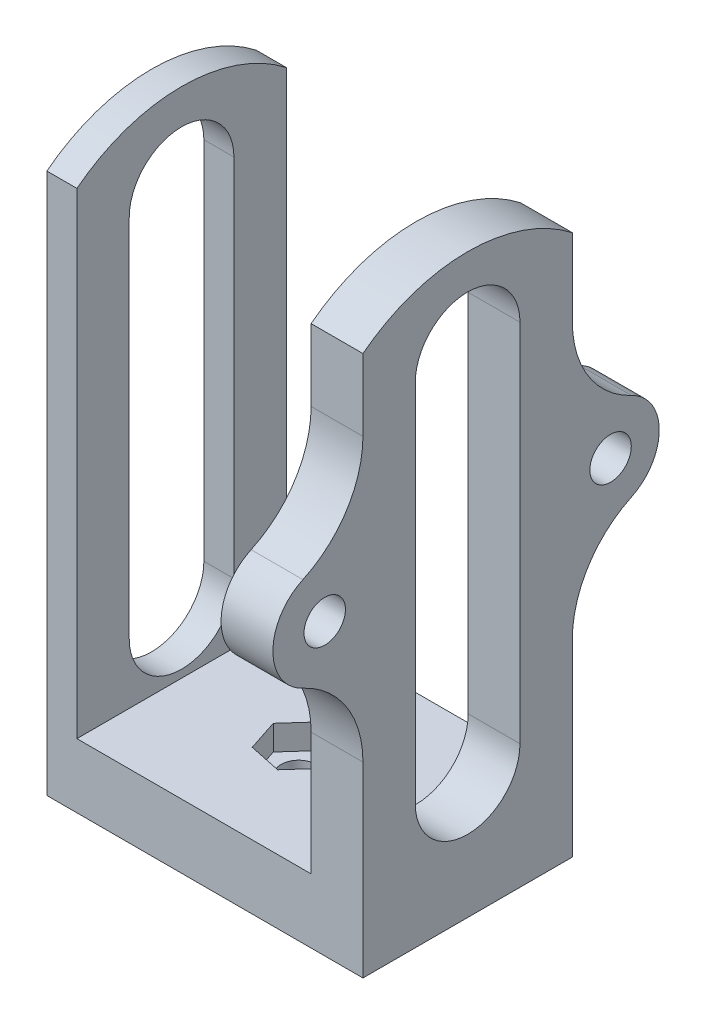
ISO-10303-21;
HEADER;
FILE_DESCRIPTION(('STEP AP214'),'2;1');
FILE_NAME('part.step','',(''),(''),'','','');
FILE_SCHEMA(('AUTOMOTIVE_DESIGN { 1 0 10303 214 1 1 1 1 }'));
ENDSEC;
DATA;
#1=APPLICATION_CONTEXT('core data for automotive mechanical design processes');
#2=APPLICATION_PROTOCOL_DEFINITION('international standard','automotive_design',2000,#1);
#3=PRODUCT_CONTEXT('',#1,'mechanical');
#4=PRODUCT('Part','Part','',(#3));
#5=PRODUCT_RELATED_PRODUCT_CATEGORY('part','',(#4));
#6=PRODUCT_DEFINITION_FORMATION('','',#4);
#7=PRODUCT_DEFINITION_CONTEXT('part definition',#1,'design');
#8=PRODUCT_DEFINITION('design','',#6,#7);
#9=PRODUCT_DEFINITION_SHAPE('','',#8);
#10=(LENGTH_UNIT() NAMED_UNIT(*) SI_UNIT(.MILLI.,.METRE.));
#11=(NAMED_UNIT(*) PLANE_ANGLE_UNIT() SI_UNIT($,.RADIAN.));
#12=(NAMED_UNIT(*) SI_UNIT($,.STERADIAN.) SOLID_ANGLE_UNIT());
#13=UNCERTAINTY_MEASURE_WITH_UNIT(LENGTH_MEASURE(1.E-05),#10,'distance_accuracy_value','');
#14=(GEOMETRIC_REPRESENTATION_CONTEXT(3) GLOBAL_UNCERTAINTY_ASSIGNED_CONTEXT((#13)) GLOBAL_UNIT_ASSIGNED_CONTEXT((#10,
#11,#12)) REPRESENTATION_CONTEXT('',''));
#15=CARTESIAN_POINT('',(0.,0.,0.));
#16=DIRECTION('',(0.,0.,1.));
#17=DIRECTION('',(1.,0.,0.));
#18=AXIS2_PLACEMENT_3D('',#15,#16,#17);
#19=CARTESIAN_POINT('',(11.7,-16.2,-10.1));
#20=DIRECTION('',(0.,1.,0.));
#21=DIRECTION('',(-1.,0.,0.));
#22=AXIS2_PLACEMENT_3D('',#19,#20,#21);
#23=CYLINDRICAL_SURFACE('',#22,1.7);
#24=CARTESIAN_POINT('',(11.7,-1.14491749414469E-13,-10.1));
#25=DIRECTION('',(0.,-1.,0.));
#26=DIRECTION('',(1.,0.,0.));
#27=AXIS2_PLACEMENT_3D('',#24,#25,#26);
#28=CIRCLE('',#27,1.7);
#29=CARTESIAN_POINT('',(13.4,-1.15124282314152E-13,-10.1));
#30=VERTEX_POINT('',#29);
#31=EDGE_CURVE('E290',#30,#30,#28,.T.);
#32=ORIENTED_EDGE('',*,*,#31,.T.);
#33=EDGE_LOOP('',(#32));
#34=FACE_BOUND('',#33,.T.);
#35=CARTESIAN_POINT('',(11.7,3.80000000000002,-10.1));
#36=DIRECTION('',(0.,1.,0.));
#37=DIRECTION('',(-1.,0.,0.));
#38=AXIS2_PLACEMENT_3D('',#35,#36,#37);
#39=CIRCLE('',#38,1.7);
#40=CARTESIAN_POINT('',(9.99999999999999,3.80000000000002,-10.1));
#41=VERTEX_POINT('',#40);
#42=EDGE_CURVE('E41',#41,#41,#39,.F.);
#43=ORIENTED_EDGE('',*,*,#42,.F.);
#44=EDGE_LOOP('',(#43));
#45=FACE_BOUND('',#44,.T.);
#46=ADVANCED_FACE('F37',(#34,#45),#23,.F.);
#47=CARTESIAN_POINT('',(0.,12.,-10.1));
#48=DIRECTION('',(1.,0.,0.));
#49=DIRECTION('',(0.,0.,-1.));
#50=AXIS2_PLACEMENT_3D('',#47,#48,#49);
#51=CYLINDRICAL_SURFACE('',#50,5.05);
#52=CARTESIAN_POINT('',(0.399999999999996,12.,-10.1));
#53=DIRECTION('',(1.,0.,0.));
#54=DIRECTION('',(0.,0.,-1.));
#55=AXIS2_PLACEMENT_3D('',#52,#53,#54);
#56=CIRCLE('',#55,5.05);
#57=CARTESIAN_POINT('',(0.399999999999994,12.,-15.15));
#58=VERTEX_POINT('',#57);
#59=CARTESIAN_POINT('',(0.399999999999996,12.,-5.05));
#60=VERTEX_POINT('',#59);
#61=EDGE_CURVE('E62',#58,#60,#56,.F.);
#62=ORIENTED_EDGE('',*,*,#61,.F.);
#63=DIRECTION('',(1.,0.,0.));
#64=VECTOR('',#63,1.);
#65=CARTESIAN_POINT('',(0.,12.,-15.15));
#66=LINE('',#65,#64);
#67=CARTESIAN_POINT('',(-2.50000000000001,12.,-15.15));
#68=VERTEX_POINT('',#67);
#69=EDGE_CURVE('E480',#68,#58,#66,.T.);
#70=ORIENTED_EDGE('',*,*,#69,.F.);
#71=CARTESIAN_POINT('',(-2.5,12.,-10.1));
#72=DIRECTION('',(-1.,0.,0.));
#73=DIRECTION('',(0.,0.,1.));
#74=AXIS2_PLACEMENT_3D('',#71,#72,#73);
#75=CIRCLE('',#74,5.05);
#76=CARTESIAN_POINT('',(-2.5,12.,-5.05));
#77=VERTEX_POINT('',#76);
#78=EDGE_CURVE('E316',#68,#77,#75,.T.);
#79=ORIENTED_EDGE('',*,*,#78,.T.);
#80=DIRECTION('',(1.,0.,0.));
#81=VECTOR('',#80,1.);
#82=CARTESIAN_POINT('',(0.,12.,-5.05));
#83=LINE('',#82,#81);
#84=EDGE_CURVE('E483',#77,#60,#83,.T.);
#85=ORIENTED_EDGE('',*,*,#84,.T.);
#86=EDGE_LOOP('',(#62,#70,#79,#85));
#87=FACE_BOUND('',#86,.T.);
#88=ADVANCED_FACE('F546',(#87),#51,.F.);
#89=CARTESIAN_POINT('',(0.,47.2223420938085,-15.15));
#90=DIRECTION('',(0.,0.,-1.));
#91=DIRECTION('',(0.,1.,0.));
#92=AXIS2_PLACEMENT_3D('',#89,#90,#91);
#93=PLANE('',#92);
#94=DIRECTION('',(0.,-1.,0.));
#95=VECTOR('',#94,1.);
#96=CARTESIAN_POINT('',(0.39999999999999,47.2223420938085,-15.15));
#97=LINE('',#96,#95);
#98=CARTESIAN_POINT('',(0.39999999999999,47.2223420938085,-15.15));
#99=VERTEX_POINT('',#98);
#100=EDGE_CURVE('E307',#99,#58,#97,.T.);
#101=ORIENTED_EDGE('',*,*,#100,.F.);
#102=DIRECTION('',(1.,0.,0.));
#103=VECTOR('',#102,1.);
#104=CARTESIAN_POINT('',(0.,47.2223420938085,-15.15));
#105=LINE('',#104,#103);
#106=CARTESIAN_POINT('',(-2.50000000000001,47.2223420938085,-15.15));
#107=VERTEX_POINT('',#106);
#108=EDGE_CURVE('E476',#107,#99,#105,.T.);
#109=ORIENTED_EDGE('',*,*,#108,.F.);
#110=DIRECTION('',(0.,-1.,0.));
#111=VECTOR('',#110,1.);
#112=CARTESIAN_POINT('',(-2.50000000000001,47.2223420938085,-15.15));
#113=LINE('',#112,#111);
#114=EDGE_CURVE('E313',#107,#68,#113,.T.);
#115=ORIENTED_EDGE('',*,*,#114,.T.);
#116=ORIENTED_EDGE('',*,*,#69,.T.);
#117=EDGE_LOOP('',(#101,#109,#115,#116));
#118=FACE_BOUND('',#117,.T.);
#119=ADVANCED_FACE('F553',(#118),#93,.F.);
#120=CARTESIAN_POINT('',(0.,47.2223420938085,-10.1));
#121=DIRECTION('',(1.,0.,0.));
#122=DIRECTION('',(0.,0.,-1.));
#123=AXIS2_PLACEMENT_3D('',#120,#121,#122);
#124=CYLINDRICAL_SURFACE('',#123,5.04999999999999);
#125=CARTESIAN_POINT('',(0.399999999999992,47.2223420938085,-10.1));
#126=DIRECTION('',(1.,0.,0.));
#127=DIRECTION('',(0.,0.,-1.));
#128=AXIS2_PLACEMENT_3D('',#125,#126,#127);
#129=CIRCLE('',#128,5.04999999999999);
#130=CARTESIAN_POINT('',(0.399999999999994,47.2223420938085,-5.05000000000004));
#131=VERTEX_POINT('',#130);
#132=EDGE_CURVE('E305',#131,#99,#129,.F.);
#133=ORIENTED_EDGE('',*,*,#132,.F.);
#134=DIRECTION('',(1.,0.,0.));
#135=VECTOR('',#134,1.);
#136=CARTESIAN_POINT('',(0.,47.2223420938085,-5.05000000000004));
#137=LINE('',#136,#135);
#138=CARTESIAN_POINT('',(-2.50000000000001,47.2223420938085,-5.05000000000004));
#139=VERTEX_POINT('',#138);
#140=EDGE_CURVE('E388',#139,#131,#137,.T.);
#141=ORIENTED_EDGE('',*,*,#140,.F.);
#142=CARTESIAN_POINT('',(-2.50000000000001,47.2223420938085,-10.1));
#143=DIRECTION('',(-1.,0.,0.));
#144=DIRECTION('',(0.,0.,1.));
#145=AXIS2_PLACEMENT_3D('',#142,#143,#144);
#146=CIRCLE('',#145,5.04999999999999);
#147=EDGE_CURVE('E310',#139,#107,#146,.T.);
#148=ORIENTED_EDGE('',*,*,#147,.T.);
#149=ORIENTED_EDGE('',*,*,#108,.T.);
#150=EDGE_LOOP('',(#133,#141,#148,#149));
#151=FACE_BOUND('',#150,.T.);
#152=ADVANCED_FACE('F778',(#151),#124,.F.);
#153=CARTESIAN_POINT('',(0.,12.,-5.05));
#154=DIRECTION('',(0.,0.,1.));
#155=DIRECTION('',(0.,-1.,0.));
#156=AXIS2_PLACEMENT_3D('',#153,#154,#155);
#157=PLANE('',#156);
#158=DIRECTION('',(0.,1.,0.));
#159=VECTOR('',#158,1.);
#160=CARTESIAN_POINT('',(0.399999999999998,12.,-5.05));
#161=LINE('',#160,#159);
#162=EDGE_CURVE('E303',#60,#131,#161,.T.);
#163=ORIENTED_EDGE('',*,*,#162,.F.);
#164=ORIENTED_EDGE('',*,*,#84,.F.);
#165=DIRECTION('',(0.,1.,0.));
#166=VECTOR('',#165,1.);
#167=CARTESIAN_POINT('',(-2.50000000000001,47.2223420938085,-5.05000000000004));
#168=LINE('',#167,#166);
#169=EDGE_CURVE('E319',#77,#139,#168,.T.);
#170=ORIENTED_EDGE('',*,*,#169,.T.);
#171=ORIENTED_EDGE('',*,*,#140,.T.);
#172=EDGE_LOOP('',(#163,#164,#170,#171));
#173=FACE_BOUND('',#172,.T.);
#174=ADVANCED_FACE('F789',(#173),#157,.F.);
#175=CARTESIAN_POINT('',(0.,39.1850926484793,-10.1));
#176=DIRECTION('',(1.,0.,0.));
#177=DIRECTION('',(0.,0.,-1.));
#178=AXIS2_PLACEMENT_3D('',#175,#176,#177);
#179=CYLINDRICAL_SURFACE('',#178,16.4580679801224);
#180=DIRECTION('',(1.,0.,0.));
#181=VECTOR('',#180,1.);
#182=CARTESIAN_POINT('',(0.,52.1796300253284,0.));
#183=LINE('',#182,#181);
#184=CARTESIAN_POINT('',(-2.50000000000001,52.1796300253284,0.));
#185=VERTEX_POINT('',#184);
#186=CARTESIAN_POINT('',(0.399999999999995,52.1796300253284,0.));
#187=VERTEX_POINT('',#186);
#188=EDGE_CURVE('E473',#185,#187,#183,.T.);
#189=ORIENTED_EDGE('',*,*,#188,.T.);
#190=CARTESIAN_POINT('',(0.399999999999993,39.1850926484793,-10.1));
#191=DIRECTION('',(1.,0.,0.));
#192=DIRECTION('',(0.,0.,-1.));
#193=AXIS2_PLACEMENT_3D('',#190,#191,#192);
#194=CIRCLE('',#193,16.4580679801224);
#195=CARTESIAN_POINT('',(0.399999999999988,52.1796300253284,-20.2));
#196=VERTEX_POINT('',#195);
#197=EDGE_CURVE('E301',#196,#187,#194,.T.);
#198=ORIENTED_EDGE('',*,*,#197,.F.);
#199=DIRECTION('',(1.,0.,0.));
#200=VECTOR('',#199,1.);
#201=CARTESIAN_POINT('',(0.,52.1796300253284,-20.2));
#202=LINE('',#201,#200);
#203=CARTESIAN_POINT('',(-2.50000000000001,52.1796300253284,-20.2));
#204=VERTEX_POINT('',#203);
#205=EDGE_CURVE('E479',#204,#196,#202,.T.);
#206=ORIENTED_EDGE('',*,*,#205,.F.);
#207=CARTESIAN_POINT('',(-2.50000000000001,39.1850926484793,-10.1));
#208=DIRECTION('',(-1.,0.,0.));
#209=DIRECTION('',(0.,0.,1.));
#210=AXIS2_PLACEMENT_3D('',#207,#208,#209);
#211=CIRCLE('',#210,16.4580679801224);
#212=EDGE_CURVE('E331',#185,#204,#211,.T.);
#213=ORIENTED_EDGE('',*,*,#212,.F.);
#214=EDGE_LOOP('',(#189,#198,#206,#213));
#215=FACE_BOUND('',#214,.T.);
#216=ADVANCED_FACE('F39',(#215),#179,.T.);
#217=CARTESIAN_POINT('',(23.,18.041981199993,0.));
#218=DIRECTION('',(0.,0.,1.));
#219=DIRECTION('',(0.,-1.,0.));
#220=AXIS2_PLACEMENT_3D('',#217,#218,#219);
#221=PLANE('',#220);
#222=DIRECTION('',(1.,0.,0.));
#223=VECTOR('',#222,1.);
#224=CARTESIAN_POINT('',(2.8,6.2,0.));
#225=LINE('',#224,#223);
#226=CARTESIAN_POINT('',(0.4,6.2,0.));
#227=VERTEX_POINT('',#226);
#228=CARTESIAN_POINT('',(23.,6.2,0.));
#229=VERTEX_POINT('',#228);
#230=EDGE_CURVE('E393',#227,#229,#225,.T.);
#231=ORIENTED_EDGE('',*,*,#230,.F.);
#232=DIRECTION('',(0.,-1.,0.));
#233=VECTOR('',#232,1.);
#234=CARTESIAN_POINT('',(0.399999999999995,52.1796300253284,0.));
#235=LINE('',#234,#233);
#236=EDGE_CURVE('E293',#187,#227,#235,.T.);
#237=ORIENTED_EDGE('',*,*,#236,.F.);
#238=ORIENTED_EDGE('',*,*,#188,.F.);
#239=DIRECTION('',(0.,1.,0.));
#240=VECTOR('',#239,1.);
#241=CARTESIAN_POINT('',(-2.5,0.,0.));
#242=LINE('',#241,#240);
#243=CARTESIAN_POINT('',(-2.5,0.,0.));
#244=VERTEX_POINT('',#243);
#245=EDGE_CURVE('E328',#244,#185,#242,.T.);
#246=ORIENTED_EDGE('',*,*,#245,.F.);
#247=DIRECTION('',(1.,0.,0.));
#248=VECTOR('',#247,1.);
#249=CARTESIAN_POINT('',(23.,-1.16110653565093E-13,0.));
#250=LINE('',#249,#248);
#251=CARTESIAN_POINT('',(28.,-1.17971044446513E-13,0.));
#252=VERTEX_POINT('',#251);
#253=EDGE_CURVE('E448',#244,#252,#250,.T.);
#254=ORIENTED_EDGE('',*,*,#253,.T.);
#255=DIRECTION('',(0.,-1.,0.));
#256=VECTOR('',#255,1.);
#257=CARTESIAN_POINT('',(28.,18.041981199993,0.));
#258=LINE('',#257,#256);
#259=CARTESIAN_POINT('',(28.,18.041981199993,0.));
#260=VERTEX_POINT('',#259);
#261=EDGE_CURVE('E355',#260,#252,#258,.T.);
#262=ORIENTED_EDGE('',*,*,#261,.F.);
#263=DIRECTION('',(1.,0.,0.));
#264=VECTOR('',#263,1.);
#265=CARTESIAN_POINT('',(23.,18.041981199993,0.));
#266=LINE('',#265,#264);
#267=CARTESIAN_POINT('',(23.,18.041981199993,0.));
#268=VERTEX_POINT('',#267);
#269=EDGE_CURVE('E46',#268,#260,#266,.T.);
#270=ORIENTED_EDGE('',*,*,#269,.F.);
#271=DIRECTION('',(0.,-1.,0.));
#272=VECTOR('',#271,1.);
#273=CARTESIAN_POINT('',(23.,18.041981199993,0.));
#274=LINE('',#273,#272);
#275=EDGE_CURVE('E411',#268,#229,#274,.T.);
#276=ORIENTED_EDGE('',*,*,#275,.T.);
#277=EDGE_LOOP('',(#231,#237,#238,#246,#254,#262,#270,#276));
#278=FACE_BOUND('',#277,.T.);
#279=ADVANCED_FACE('F504',(#278),#221,.T.);
#280=CARTESIAN_POINT('',(23.,18.041981199993,10.));
#281=DIRECTION('',(1.,0.,0.));
#282=DIRECTION('',(0.,0.,-1.));
#283=AXIS2_PLACEMENT_3D('',#280,#281,#282);
#284=CYLINDRICAL_SURFACE('',#283,10.);
#285=ORIENTED_EDGE('',*,*,#269,.T.);
#286=CARTESIAN_POINT('',(28.,18.041981199993,10.));
#287=DIRECTION('',(-1.,0.,0.));
#288=DIRECTION('',(0.,0.,-1.));
#289=AXIS2_PLACEMENT_3D('',#286,#287,#288);
#290=CIRCLE('',#289,10.);
#291=CARTESIAN_POINT('',(28.,27.1141339519894,5.79333333333336));
#292=VERTEX_POINT('',#291);
#293=EDGE_CURVE('E352',#292,#260,#290,.T.);
#294=ORIENTED_EDGE('',*,*,#293,.F.);
#295=DIRECTION('',(1.,0.,0.));
#296=VECTOR('',#295,1.);
#297=CARTESIAN_POINT('',(23.,27.1141339519894,5.79333333333335));
#298=LINE('',#297,#296);
#299=CARTESIAN_POINT('',(23.,27.1141339519894,5.79333333333335));
#300=VERTEX_POINT('',#299);
#301=EDGE_CURVE('E450',#300,#292,#298,.T.);
#302=ORIENTED_EDGE('',*,*,#301,.F.);
#303=CARTESIAN_POINT('',(23.,18.041981199993,10.));
#304=DIRECTION('',(-1.,0.,0.));
#305=DIRECTION('',(0.,0.,-1.));
#306=AXIS2_PLACEMENT_3D('',#303,#304,#305);
#307=CIRCLE('',#306,10.);
#308=EDGE_CURVE('E445',#300,#268,#307,.T.);
#309=ORIENTED_EDGE('',*,*,#308,.T.);
#310=EDGE_LOOP('',(#285,#294,#302,#309));
#311=FACE_BOUND('',#310,.T.);
#312=ADVANCED_FACE('F590',(#311),#284,.F.);
#313=CARTESIAN_POINT('',(23.,31.6502103279876,3.69000000000002));
#314=DIRECTION('',(1.,0.,0.));
#315=DIRECTION('',(0.,0.,-1.));
#316=AXIS2_PLACEMENT_3D('',#313,#314,#315);
#317=CYLINDRICAL_SURFACE('',#316,5.);
#318=ORIENTED_EDGE('',*,*,#301,.T.);
#319=CARTESIAN_POINT('',(28.,31.6502103279876,3.69000000000003));
#320=DIRECTION('',(1.,0.,0.));
#321=DIRECTION('',(0.,0.,-1.));
#322=AXIS2_PLACEMENT_3D('',#319,#320,#321);
#323=CIRCLE('',#322,5.);
#324=CARTESIAN_POINT('',(28.,36.1862867039858,5.79333333333335));
#325=VERTEX_POINT('',#324);
#326=EDGE_CURVE('E385',#325,#292,#323,.T.);
#327=ORIENTED_EDGE('',*,*,#326,.F.);
#328=DIRECTION('',(1.,0.,0.));
#329=VECTOR('',#328,1.);
#330=CARTESIAN_POINT('',(23.,36.1862867039858,5.79333333333335));
#331=LINE('',#330,#329);
#332=CARTESIAN_POINT('',(23.,36.1862867039858,5.79333333333335));
#333=VERTEX_POINT('',#332);
#334=EDGE_CURVE('E452',#333,#325,#331,.T.);
#335=ORIENTED_EDGE('',*,*,#334,.F.);
#336=CARTESIAN_POINT('',(23.,31.6502103279876,3.69000000000002));
#337=DIRECTION('',(1.,0.,0.));
#338=DIRECTION('',(0.,0.,-1.));
#339=AXIS2_PLACEMENT_3D('',#336,#337,#338);
#340=CIRCLE('',#339,5.);
#341=EDGE_CURVE('E442',#333,#300,#340,.T.);
#342=ORIENTED_EDGE('',*,*,#341,.T.);
#343=EDGE_LOOP('',(#318,#327,#335,#342));
#344=FACE_BOUND('',#343,.T.);
#345=ADVANCED_FACE('F593',(#344),#317,.T.);
#346=CARTESIAN_POINT('',(23.,45.2584394559822,10.));
#347=DIRECTION('',(1.,0.,0.));
#348=DIRECTION('',(0.,0.,-1.));
#349=AXIS2_PLACEMENT_3D('',#346,#347,#348);
#350=CYLINDRICAL_SURFACE('',#349,10.);
#351=ORIENTED_EDGE('',*,*,#334,.T.);
#352=CARTESIAN_POINT('',(28.,45.2584394559822,10.));
#353=DIRECTION('',(-1.,0.,0.));
#354=DIRECTION('',(0.,0.,-1.));
#355=AXIS2_PLACEMENT_3D('',#352,#353,#354);
#356=CIRCLE('',#355,10.);
#357=CARTESIAN_POINT('',(28.,45.2584394559822,0.));
#358=VERTEX_POINT('',#357);
#359=EDGE_CURVE('E382',#358,#325,#356,.T.);
#360=ORIENTED_EDGE('',*,*,#359,.F.);
#361=DIRECTION('',(1.,0.,0.));
#362=VECTOR('',#361,1.);
#363=CARTESIAN_POINT('',(23.,45.2584394559822,0.));
#364=LINE('',#363,#362);
#365=CARTESIAN_POINT('',(23.,45.2584394559822,0.));
#366=VERTEX_POINT('',#365);
#367=EDGE_CURVE('E454',#366,#358,#364,.T.);
#368=ORIENTED_EDGE('',*,*,#367,.F.);
#369=CARTESIAN_POINT('',(23.,45.2584394559822,10.));
#370=DIRECTION('',(-1.,0.,0.));
#371=DIRECTION('',(0.,0.,1.));
#372=AXIS2_PLACEMENT_3D('',#369,#370,#371);
#373=CIRCLE('',#372,10.);
#374=EDGE_CURVE('E439',#366,#333,#373,.T.);
#375=ORIENTED_EDGE('',*,*,#374,.T.);
#376=EDGE_LOOP('',(#351,#360,#368,#375));
#377=FACE_BOUND('',#376,.T.);
#378=ADVANCED_FACE('F597',(#377),#350,.F.);
#379=CARTESIAN_POINT('',(23.,52.1796300253283,0.));
#380=DIRECTION('',(0.,0.,1.));
#381=DIRECTION('',(0.,-1.,0.));
#382=AXIS2_PLACEMENT_3D('',#379,#380,#381);
#383=PLANE('',#382);
#384=ORIENTED_EDGE('',*,*,#367,.T.);
#385=DIRECTION('',(0.,-1.,0.));
#386=VECTOR('',#385,1.);
#387=CARTESIAN_POINT('',(28.,52.1796300253283,0.));
#388=LINE('',#387,#386);
#389=CARTESIAN_POINT('',(28.,52.1796300253283,0.));
#390=VERTEX_POINT('',#389);
#391=EDGE_CURVE('E379',#390,#358,#388,.T.);
#392=ORIENTED_EDGE('',*,*,#391,.F.);
#393=DIRECTION('',(1.,0.,0.));
#394=VECTOR('',#393,1.);
#395=CARTESIAN_POINT('',(23.,52.1796300253283,0.));
#396=LINE('',#395,#394);
#397=CARTESIAN_POINT('',(23.,52.1796300253283,0.));
#398=VERTEX_POINT('',#397);
#399=EDGE_CURVE('E456',#398,#390,#396,.T.);
#400=ORIENTED_EDGE('',*,*,#399,.F.);
#401=DIRECTION('',(0.,-1.,0.));
#402=VECTOR('',#401,1.);
#403=CARTESIAN_POINT('',(23.,52.1796300253283,0.));
#404=LINE('',#403,#402);
#405=EDGE_CURVE('E436',#398,#366,#404,.T.);
#406=ORIENTED_EDGE('',*,*,#405,.T.);
#407=EDGE_LOOP('',(#384,#392,#400,#406));
#408=FACE_BOUND('',#407,.T.);
#409=ADVANCED_FACE('F601',(#408),#383,.T.);
#410=CARTESIAN_POINT('',(23.,39.1850926484792,-10.1));
#411=DIRECTION('',(1.,0.,0.));
#412=DIRECTION('',(0.,0.,-1.));
#413=AXIS2_PLACEMENT_3D('',#410,#411,#412);
#414=CYLINDRICAL_SURFACE('',#413,16.4580679801224);
#415=ORIENTED_EDGE('',*,*,#399,.T.);
#416=CARTESIAN_POINT('',(28.,39.1850926484792,-10.1));
#417=DIRECTION('',(1.,0.,0.));
#418=DIRECTION('',(0.,0.,-1.));
#419=AXIS2_PLACEMENT_3D('',#416,#417,#418);
#420=CIRCLE('',#419,16.4580679801224);
#421=CARTESIAN_POINT('',(28.,52.1796300253283,-20.2));
#422=VERTEX_POINT('',#421);
#423=EDGE_CURVE('E376',#422,#390,#420,.T.);
#424=ORIENTED_EDGE('',*,*,#423,.F.);
#425=DIRECTION('',(1.,0.,0.));
#426=VECTOR('',#425,1.);
#427=CARTESIAN_POINT('',(23.,52.1796300253283,-20.2));
#428=LINE('',#427,#426);
#429=CARTESIAN_POINT('',(23.,52.1796300253283,-20.2));
#430=VERTEX_POINT('',#429);
#431=EDGE_CURVE('E458',#430,#422,#428,.T.);
#432=ORIENTED_EDGE('',*,*,#431,.F.);
#433=CARTESIAN_POINT('',(23.,39.1850926484792,-10.1));
#434=DIRECTION('',(1.,0.,0.));
#435=DIRECTION('',(0.,0.,-1.));
#436=AXIS2_PLACEMENT_3D('',#433,#434,#435);
#437=CIRCLE('',#436,16.4580679801224);
#438=EDGE_CURVE('E433',#430,#398,#437,.T.);
#439=ORIENTED_EDGE('',*,*,#438,.T.);
#440=EDGE_LOOP('',(#415,#424,#432,#439));
#441=FACE_BOUND('',#440,.T.);
#442=ADVANCED_FACE('F605',(#441),#414,.T.);
#443=CARTESIAN_POINT('',(23.,44.754426549422,-20.2));
#444=DIRECTION('',(0.,0.,-1.));
#445=DIRECTION('',(0.,1.,0.));
#446=AXIS2_PLACEMENT_3D('',#443,#444,#445);
#447=PLANE('',#446);
#448=ORIENTED_EDGE('',*,*,#431,.T.);
#449=DIRECTION('',(0.,1.,0.));
#450=VECTOR('',#449,1.);
#451=CARTESIAN_POINT('',(28.,44.754426549422,-20.2));
#452=LINE('',#451,#450);
#453=CARTESIAN_POINT('',(28.,44.754426549422,-20.2));
#454=VERTEX_POINT('',#453);
#455=EDGE_CURVE('E373',#454,#422,#452,.T.);
#456=ORIENTED_EDGE('',*,*,#455,.F.);
#457=DIRECTION('',(1.,0.,0.));
#458=VECTOR('',#457,1.);
#459=CARTESIAN_POINT('',(23.,44.754426549422,-20.2));
#460=LINE('',#459,#458);
#461=CARTESIAN_POINT('',(23.,44.754426549422,-20.2));
#462=VERTEX_POINT('',#461);
#463=EDGE_CURVE('E460',#462,#454,#460,.T.);
#464=ORIENTED_EDGE('',*,*,#463,.F.);
#465=DIRECTION('',(0.,1.,0.));
#466=VECTOR('',#465,1.);
#467=CARTESIAN_POINT('',(23.,44.754426549422,-20.2));
#468=LINE('',#467,#466);
#469=EDGE_CURVE('E430',#462,#430,#468,.T.);
#470=ORIENTED_EDGE('',*,*,#469,.T.);
#471=EDGE_LOOP('',(#448,#456,#464,#470));
#472=FACE_BOUND('',#471,.T.);
#473=ADVANCED_FACE('F609',(#472),#447,.T.);
#474=CARTESIAN_POINT('',(23.0000000000001,44.754426549422,-30.2));
#475=DIRECTION('',(1.,0.,0.));
#476=DIRECTION('',(0.,0.,-1.));
#477=AXIS2_PLACEMENT_3D('',#474,#475,#476);
#478=CYLINDRICAL_SURFACE('',#477,10.);
#479=ORIENTED_EDGE('',*,*,#463,.T.);
#480=CARTESIAN_POINT('',(28.0000000000001,44.754426549422,-30.2));
#481=DIRECTION('',(-1.,0.,0.));
#482=DIRECTION('',(0.,0.,-1.));
#483=AXIS2_PLACEMENT_3D('',#480,#481,#482);
#484=CIRCLE('',#483,10.);
#485=CARTESIAN_POINT('',(28.,35.7229526528202,-25.9066936686277));
#486=VERTEX_POINT('',#485);
#487=EDGE_CURVE('E370',#486,#454,#484,.T.);
#488=ORIENTED_EDGE('',*,*,#487,.F.);
#489=DIRECTION('',(1.,0.,0.));
#490=VECTOR('',#489,1.);
#491=CARTESIAN_POINT('',(23.,35.7229526528202,-25.9066936686277));
#492=LINE('',#491,#490);
#493=CARTESIAN_POINT('',(23.,35.7229526528202,-25.9066936686277));
#494=VERTEX_POINT('',#493);
#495=EDGE_CURVE('E462',#494,#486,#492,.T.);
#496=ORIENTED_EDGE('',*,*,#495,.F.);
#497=CARTESIAN_POINT('',(23.0000000000001,44.754426549422,-30.2));
#498=DIRECTION('',(-1.,0.,0.));
#499=DIRECTION('',(0.,0.,-1.));
#500=AXIS2_PLACEMENT_3D('',#497,#498,#499);
#501=CIRCLE('',#500,10.);
#502=EDGE_CURVE('E427',#494,#462,#501,.T.);
#503=ORIENTED_EDGE('',*,*,#502,.T.);
#504=EDGE_LOOP('',(#479,#488,#496,#503));
#505=FACE_BOUND('',#504,.T.);
#506=ADVANCED_FACE('F613',(#505),#478,.F.);
#507=CARTESIAN_POINT('',(23.,31.4806007636569,-23.89));
#508=DIRECTION('',(1.,0.,0.));
#509=DIRECTION('',(0.,0.,-1.));
#510=AXIS2_PLACEMENT_3D('',#507,#508,#509);
#511=CYLINDRICAL_SURFACE('',#510,4.69729740431352);
#512=ORIENTED_EDGE('',*,*,#495,.T.);
#513=CARTESIAN_POINT('',(28.,31.4806007636569,-23.89));
#514=DIRECTION('',(1.,0.,0.));
#515=DIRECTION('',(0.,0.,-1.));
#516=AXIS2_PLACEMENT_3D('',#513,#514,#515);
#517=CIRCLE('',#516,4.69729740431352);
#518=CARTESIAN_POINT('',(28.,27.2382488744936,-25.9066936686277));
#519=VERTEX_POINT('',#518);
#520=EDGE_CURVE('E367',#519,#486,#517,.T.);
#521=ORIENTED_EDGE('',*,*,#520,.F.);
#522=DIRECTION('',(1.,0.,0.));
#523=VECTOR('',#522,1.);
#524=CARTESIAN_POINT('',(23.,27.2382488744936,-25.9066936686277));
#525=LINE('',#524,#523);
#526=CARTESIAN_POINT('',(23.,27.2382488744936,-25.9066936686277));
#527=VERTEX_POINT('',#526);
#528=EDGE_CURVE('E464',#527,#519,#525,.T.);
#529=ORIENTED_EDGE('',*,*,#528,.F.);
#530=CARTESIAN_POINT('',(23.,31.4806007636569,-23.89));
#531=DIRECTION('',(1.,0.,0.));
#532=DIRECTION('',(0.,0.,-1.));
#533=AXIS2_PLACEMENT_3D('',#530,#531,#532);
#534=CIRCLE('',#533,4.69729740431352);
#535=EDGE_CURVE('E424',#527,#494,#534,.T.);
#536=ORIENTED_EDGE('',*,*,#535,.T.);
#537=EDGE_LOOP('',(#512,#521,#529,#536));
#538=FACE_BOUND('',#537,.T.);
#539=ADVANCED_FACE('F617',(#538),#511,.T.);
#540=CARTESIAN_POINT('',(23.,18.2067749778919,-30.2));
#541=DIRECTION('',(1.,0.,0.));
#542=DIRECTION('',(0.,0.,-1.));
#543=AXIS2_PLACEMENT_3D('',#540,#541,#542);
#544=CYLINDRICAL_SURFACE('',#543,10.);
#545=ORIENTED_EDGE('',*,*,#528,.T.);
#546=CARTESIAN_POINT('',(28.,18.2067749778919,-30.2));
#547=DIRECTION('',(-1.,0.,0.));
#548=DIRECTION('',(0.,0.,-1.));
#549=AXIS2_PLACEMENT_3D('',#546,#547,#548);
#550=CIRCLE('',#549,10.);
#551=CARTESIAN_POINT('',(28.,18.2067749778919,-20.2));
#552=VERTEX_POINT('',#551);
#553=EDGE_CURVE('E364',#552,#519,#550,.T.);
#554=ORIENTED_EDGE('',*,*,#553,.F.);
#555=DIRECTION('',(1.,0.,0.));
#556=VECTOR('',#555,1.);
#557=CARTESIAN_POINT('',(23.,18.2067749778919,-20.2));
#558=LINE('',#557,#556);
#559=CARTESIAN_POINT('',(23.,18.2067749778919,-20.2));
#560=VERTEX_POINT('',#559);
#561=EDGE_CURVE('E466',#560,#552,#558,.T.);
#562=ORIENTED_EDGE('',*,*,#561,.F.);
#563=CARTESIAN_POINT('',(23.,18.2067749778919,-30.2));
#564=DIRECTION('',(-1.,0.,0.));
#565=DIRECTION('',(0.,0.,1.));
#566=AXIS2_PLACEMENT_3D('',#563,#564,#565);
#567=CIRCLE('',#566,10.);
#568=EDGE_CURVE('E421',#560,#527,#567,.T.);
#569=ORIENTED_EDGE('',*,*,#568,.T.);
#570=EDGE_LOOP('',(#545,#554,#562,#569));
#571=FACE_BOUND('',#570,.T.);
#572=ADVANCED_FACE('F522',(#571),#544,.F.);
#573=CARTESIAN_POINT('',(23.,-1.2171727983945E-13,-20.1999999999999));
#574=DIRECTION('',(0.,0.,-1.));
#575=DIRECTION('',(0.,1.,0.));
#576=AXIS2_PLACEMENT_3D('',#573,#574,#575);
#577=PLANE('',#576);
#578=DIRECTION('',(0.,1.,0.));
#579=VECTOR('',#578,1.);
#580=CARTESIAN_POINT('',(0.399999999999993,6.2,-20.2));
#581=LINE('',#580,#579);
#582=CARTESIAN_POINT('',(0.399999999999993,6.2,-20.2));
#583=VERTEX_POINT('',#582);
#584=EDGE_CURVE('E299',#583,#196,#581,.T.);
#585=ORIENTED_EDGE('',*,*,#584,.F.);
#586=DIRECTION('',(-1.,0.,0.));
#587=VECTOR('',#586,1.);
#588=CARTESIAN_POINT('',(23.,6.2,-20.2));
#589=LINE('',#588,#587);
#590=CARTESIAN_POINT('',(23.,6.2,-20.2));
#591=VERTEX_POINT('',#590);
#592=EDGE_CURVE('E471',#591,#583,#589,.T.);
#593=ORIENTED_EDGE('',*,*,#592,.F.);
#594=DIRECTION('',(0.,1.,0.));
#595=VECTOR('',#594,1.);
#596=CARTESIAN_POINT('',(23.,-1.2171727983945E-13,-20.1999999999999));
#597=LINE('',#596,#595);
#598=EDGE_CURVE('E419',#591,#560,#597,.T.);
#599=ORIENTED_EDGE('',*,*,#598,.T.);
#600=ORIENTED_EDGE('',*,*,#561,.T.);
#601=DIRECTION('',(0.,1.,0.));
#602=VECTOR('',#601,1.);
#603=CARTESIAN_POINT('',(28.,-1.2357767072087E-13,-20.1999999999999));
#604=LINE('',#603,#602);
#605=CARTESIAN_POINT('',(28.,-1.2357767072087E-13,-20.1999999999999));
#606=VERTEX_POINT('',#605);
#607=EDGE_CURVE('E361',#606,#552,#604,.T.);
#608=ORIENTED_EDGE('',*,*,#607,.F.);
#609=DIRECTION('',(1.,0.,0.));
#610=VECTOR('',#609,1.);
#611=CARTESIAN_POINT('',(23.,-1.2171727983945E-13,-20.1999999999999));
#612=LINE('',#611,#610);
#613=CARTESIAN_POINT('',(-2.50000000000001,0.,-20.2));
#614=VERTEX_POINT('',#613);
#615=EDGE_CURVE('E468',#614,#606,#612,.T.);
#616=ORIENTED_EDGE('',*,*,#615,.F.);
#617=DIRECTION('',(0.,-1.,0.));
#618=VECTOR('',#617,1.);
#619=CARTESIAN_POINT('',(-2.50000000000001,52.1796300253284,-20.2));
#620=LINE('',#619,#618);
#621=EDGE_CURVE('E322',#204,#614,#620,.T.);
#622=ORIENTED_EDGE('',*,*,#621,.F.);
#623=ORIENTED_EDGE('',*,*,#205,.T.);
#624=EDGE_LOOP('',(#585,#593,#599,#600,#608,#616,#622,#623));
#625=FACE_BOUND('',#624,.T.);
#626=ADVANCED_FACE('F493',(#625),#577,.T.);
#627=CARTESIAN_POINT('',(23.,-1.16110653565093E-13,0.));
#628=DIRECTION('',(0.,-1.,0.));
#629=DIRECTION('',(-1.,0.,0.));
#630=AXIS2_PLACEMENT_3D('',#627,#628,#629);
#631=PLANE('',#630);
#632=ORIENTED_EDGE('',*,*,#31,.F.);
#633=EDGE_LOOP('',(#632));
#634=FACE_BOUND('',#633,.T.);
#635=ORIENTED_EDGE('',*,*,#615,.T.);
#636=DIRECTION('',(0.,0.,-1.));
#637=VECTOR('',#636,1.);
#638=CARTESIAN_POINT('',(28.,-1.17971044446513E-13,0.));
#639=LINE('',#638,#637);
#640=EDGE_CURVE('E358',#252,#606,#639,.T.);
#641=ORIENTED_EDGE('',*,*,#640,.F.);
#642=ORIENTED_EDGE('',*,*,#253,.F.);
#643=DIRECTION('',(0.,0.,1.));
#644=VECTOR('',#643,1.);
#645=CARTESIAN_POINT('',(-2.50000000000001,0.,-20.2));
#646=LINE('',#645,#644);
#647=EDGE_CURVE('E325',#614,#244,#646,.T.);
#648=ORIENTED_EDGE('',*,*,#647,.F.);
#649=EDGE_LOOP('',(#635,#641,#642,#648));
#650=FACE_BOUND('',#649,.T.);
#651=ADVANCED_FACE('F531',(#634,#650),#631,.T.);
#652=CARTESIAN_POINT('',(23.,18.2067749778919,-30.2));
#653=DIRECTION('',(-1.,0.,0.));
#654=DIRECTION('',(0.,0.,1.));
#655=AXIS2_PLACEMENT_3D('',#652,#653,#654);
#656=PLANE('',#655);
#657=DIRECTION('',(0.,0.,-1.));
#658=VECTOR('',#657,1.);
#659=CARTESIAN_POINT('',(23.,6.2,0.));
#660=LINE('',#659,#658);
#661=EDGE_CURVE('E11',#229,#591,#660,.T.);
#662=ORIENTED_EDGE('',*,*,#661,.F.);
#663=ORIENTED_EDGE('',*,*,#275,.F.);
#664=ORIENTED_EDGE('',*,*,#308,.F.);
#665=ORIENTED_EDGE('',*,*,#341,.F.);
#666=ORIENTED_EDGE('',*,*,#374,.F.);
#667=ORIENTED_EDGE('',*,*,#405,.F.);
#668=ORIENTED_EDGE('',*,*,#438,.F.);
#669=ORIENTED_EDGE('',*,*,#469,.F.);
#670=ORIENTED_EDGE('',*,*,#502,.F.);
#671=ORIENTED_EDGE('',*,*,#535,.F.);
#672=ORIENTED_EDGE('',*,*,#568,.F.);
#673=ORIENTED_EDGE('',*,*,#598,.F.);
#674=EDGE_LOOP('',(#662,#663,#664,#665,#666,#667,#668,#669,#670,#671,#672,#673));
#675=FACE_BOUND('',#674,.T.);
#676=CARTESIAN_POINT('',(23.,31.4806007636569,-23.89));
#677=DIRECTION('',(1.,0.,0.));
#678=DIRECTION('',(0.,0.,-1.));
#679=AXIS2_PLACEMENT_3D('',#676,#677,#678);
#680=CIRCLE('',#679,1.99999999999986);
#681=CARTESIAN_POINT('',(23.,31.4806007636569,-25.8899999999998));
#682=VERTEX_POINT('',#681);
#683=EDGE_CURVE('E389',#682,#682,#680,.T.);
#684=ORIENTED_EDGE('',*,*,#683,.T.);
#685=EDGE_LOOP('',(#684));
#686=FACE_BOUND('',#685,.T.);
#687=CARTESIAN_POINT('',(23.,31.6502103279876,3.69000000000002));
#688=DIRECTION('',(1.,0.,0.));
#689=DIRECTION('',(0.,0.,-1.));
#690=AXIS2_PLACEMENT_3D('',#687,#688,#689);
#691=CIRCLE('',#690,2.);
#692=CARTESIAN_POINT('',(23.,31.6502103279876,1.69000000000002));
#693=VERTEX_POINT('',#692);
#694=EDGE_CURVE('E392',#693,#693,#691,.T.);
#695=ORIENTED_EDGE('',*,*,#694,.T.);
#696=EDGE_LOOP('',(#695));
#697=FACE_BOUND('',#696,.T.);
#698=CARTESIAN_POINT('',(23.,12.,-10.1));
#699=DIRECTION('',(1.,0.,0.));
#700=DIRECTION('',(0.,0.,-1.));
#701=AXIS2_PLACEMENT_3D('',#698,#699,#700);
#702=CIRCLE('',#701,5.05);
#703=CARTESIAN_POINT('',(23.,12.,-5.04999999999998));
#704=VERTEX_POINT('',#703);
#705=CARTESIAN_POINT('',(23.,12.,-15.15));
#706=VERTEX_POINT('',#705);
#707=EDGE_CURVE('E396',#704,#706,#702,.T.);
#708=ORIENTED_EDGE('',*,*,#707,.T.);
#709=DIRECTION('',(0.,1.,0.));
#710=VECTOR('',#709,1.);
#711=CARTESIAN_POINT('',(23.,12.,-15.15));
#712=LINE('',#711,#710);
#713=CARTESIAN_POINT('',(23.,47.2223420938085,-15.15));
#714=VERTEX_POINT('',#713);
#715=EDGE_CURVE('E399',#706,#714,#712,.T.);
#716=ORIENTED_EDGE('',*,*,#715,.T.);
#717=CARTESIAN_POINT('',(23.,47.2223420938085,-10.1));
#718=DIRECTION('',(1.,0.,0.));
#719=DIRECTION('',(0.,0.,-1.));
#720=AXIS2_PLACEMENT_3D('',#717,#718,#719);
#721=CIRCLE('',#720,5.04999999999999);
#722=CARTESIAN_POINT('',(23.,47.2223420938085,-5.05000000000001));
#723=VERTEX_POINT('',#722);
#724=EDGE_CURVE('E402',#714,#723,#721,.T.);
#725=ORIENTED_EDGE('',*,*,#724,.T.);
#726=DIRECTION('',(0.,-1.,0.));
#727=VECTOR('',#726,1.);
#728=CARTESIAN_POINT('',(23.,47.2223420938085,-5.05000000000001));
#729=LINE('',#728,#727);
#730=EDGE_CURVE('E405',#723,#704,#729,.T.);
#731=ORIENTED_EDGE('',*,*,#730,.T.);
#732=EDGE_LOOP('',(#708,#716,#725,#731));
#733=FACE_BOUND('',#732,.T.);
#734=ADVANCED_FACE('F516',(#675,#686,#697,#733),#656,.T.);
#735=CARTESIAN_POINT('',(23.,12.,-10.1));
#736=DIRECTION('',(1.,0.,0.));
#737=DIRECTION('',(0.,0.,-1.));
#738=AXIS2_PLACEMENT_3D('',#735,#736,#737);
#739=CYLINDRICAL_SURFACE('',#738,5.05);
#740=DIRECTION('',(1.,0.,0.));
#741=VECTOR('',#740,1.);
#742=CARTESIAN_POINT('',(23.,12.,-5.04999999999998));
#743=LINE('',#742,#741);
#744=CARTESIAN_POINT('',(28.,12.,-5.04999999999997));
#745=VERTEX_POINT('',#744);
#746=EDGE_CURVE('E409',#704,#745,#743,.T.);
#747=ORIENTED_EDGE('',*,*,#746,.T.);
#748=CARTESIAN_POINT('',(28.,12.,-10.1));
#749=DIRECTION('',(1.,0.,0.));
#750=DIRECTION('',(0.,0.,-1.));
#751=AXIS2_PLACEMENT_3D('',#748,#749,#750);
#752=CIRCLE('',#751,5.05);
#753=CARTESIAN_POINT('',(28.,12.,-15.15));
#754=VERTEX_POINT('',#753);
#755=EDGE_CURVE('E340',#745,#754,#752,.T.);
#756=ORIENTED_EDGE('',*,*,#755,.T.);
#757=DIRECTION('',(1.,0.,0.));
#758=VECTOR('',#757,1.);
#759=CARTESIAN_POINT('',(23.,12.,-15.15));
#760=LINE('',#759,#758);
#761=EDGE_CURVE('E408',#706,#754,#760,.T.);
#762=ORIENTED_EDGE('',*,*,#761,.F.);
#763=ORIENTED_EDGE('',*,*,#707,.F.);
#764=EDGE_LOOP('',(#747,#756,#762,#763));
#765=FACE_BOUND('',#764,.T.);
#766=ADVANCED_FACE('F540',(#765),#739,.F.);
#767=CARTESIAN_POINT('',(23.,47.2223420938085,-5.05000000000001));
#768=DIRECTION('',(0.,0.,1.));
#769=DIRECTION('',(0.,-1.,0.));
#770=AXIS2_PLACEMENT_3D('',#767,#768,#769);
#771=PLANE('',#770);
#772=DIRECTION('',(1.,0.,0.));
#773=VECTOR('',#772,1.);
#774=CARTESIAN_POINT('',(23.,47.2223420938085,-5.05000000000001));
#775=LINE('',#774,#773);
#776=CARTESIAN_POINT('',(28.,47.2223420938085,-5.05000000000001));
#777=VERTEX_POINT('',#776);
#778=EDGE_CURVE('E412',#723,#777,#775,.T.);
#779=ORIENTED_EDGE('',*,*,#778,.T.);
#780=DIRECTION('',(0.,-1.,0.));
#781=VECTOR('',#780,1.);
#782=CARTESIAN_POINT('',(28.,47.2223420938085,-5.05000000000001));
#783=LINE('',#782,#781);
#784=EDGE_CURVE('E337',#777,#745,#783,.T.);
#785=ORIENTED_EDGE('',*,*,#784,.T.);
#786=ORIENTED_EDGE('',*,*,#746,.F.);
#787=ORIENTED_EDGE('',*,*,#730,.F.);
#788=EDGE_LOOP('',(#779,#785,#786,#787));
#789=FACE_BOUND('',#788,.T.);
#790=ADVANCED_FACE('F576',(#789),#771,.F.);
#791=CARTESIAN_POINT('',(23.,47.2223420938085,-10.1));
#792=DIRECTION('',(1.,0.,0.));
#793=DIRECTION('',(0.,0.,-1.));
#794=AXIS2_PLACEMENT_3D('',#791,#792,#793);
#795=CYLINDRICAL_SURFACE('',#794,5.04999999999999);
#796=DIRECTION('',(1.,0.,0.));
#797=VECTOR('',#796,1.);
#798=CARTESIAN_POINT('',(23.,47.2223420938085,-15.15));
#799=LINE('',#798,#797);
#800=CARTESIAN_POINT('',(28.,47.2223420938085,-15.15));
#801=VERTEX_POINT('',#800);
#802=EDGE_CURVE('E414',#714,#801,#799,.T.);
#803=ORIENTED_EDGE('',*,*,#802,.T.);
#804=CARTESIAN_POINT('',(28.,47.2223420938085,-10.1));
#805=DIRECTION('',(1.,0.,0.));
#806=DIRECTION('',(0.,0.,-1.));
#807=AXIS2_PLACEMENT_3D('',#804,#805,#806);
#808=CIRCLE('',#807,5.04999999999999);
#809=EDGE_CURVE('E334',#801,#777,#808,.T.);
#810=ORIENTED_EDGE('',*,*,#809,.T.);
#811=ORIENTED_EDGE('',*,*,#778,.F.);
#812=ORIENTED_EDGE('',*,*,#724,.F.);
#813=EDGE_LOOP('',(#803,#810,#811,#812));
#814=FACE_BOUND('',#813,.T.);
#815=ADVANCED_FACE('F579',(#814),#795,.F.);
#816=CARTESIAN_POINT('',(23.,12.,-15.15));
#817=DIRECTION('',(0.,0.,-1.));
#818=DIRECTION('',(0.,1.,0.));
#819=AXIS2_PLACEMENT_3D('',#816,#817,#818);
#820=PLANE('',#819);
#821=ORIENTED_EDGE('',*,*,#761,.T.);
#822=DIRECTION('',(0.,1.,0.));
#823=VECTOR('',#822,1.);
#824=CARTESIAN_POINT('',(28.,47.2223420938085,-15.15));
#825=LINE('',#824,#823);
#826=EDGE_CURVE('E343',#754,#801,#825,.T.);
#827=ORIENTED_EDGE('',*,*,#826,.T.);
#828=ORIENTED_EDGE('',*,*,#802,.F.);
#829=ORIENTED_EDGE('',*,*,#715,.F.);
#830=EDGE_LOOP('',(#821,#827,#828,#829));
#831=FACE_BOUND('',#830,.T.);
#832=ADVANCED_FACE('F574',(#831),#820,.F.);
#833=CARTESIAN_POINT('',(23.,31.6502103279876,3.69000000000002));
#834=DIRECTION('',(1.,0.,0.));
#835=DIRECTION('',(0.,0.,-1.));
#836=AXIS2_PLACEMENT_3D('',#833,#834,#835);
#837=CYLINDRICAL_SURFACE('',#836,2.);
#838=ORIENTED_EDGE('',*,*,#694,.F.);
#839=EDGE_LOOP('',(#838));
#840=FACE_BOUND('',#839,.T.);
#841=CARTESIAN_POINT('',(28.,31.6502103279876,3.69000000000003));
#842=DIRECTION('',(1.,0.,0.));
#843=DIRECTION('',(0.,0.,-1.));
#844=AXIS2_PLACEMENT_3D('',#841,#842,#843);
#845=CIRCLE('',#844,2.);
#846=CARTESIAN_POINT('',(28.,31.6502103279876,1.69000000000002));
#847=VERTEX_POINT('',#846);
#848=EDGE_CURVE('E349',#847,#847,#845,.T.);
#849=ORIENTED_EDGE('',*,*,#848,.T.);
#850=EDGE_LOOP('',(#849));
#851=FACE_BOUND('',#850,.T.);
#852=ADVANCED_FACE('F570',(#840,#851),#837,.F.);
#853=CARTESIAN_POINT('',(23.,31.4806007636569,-23.89));
#854=DIRECTION('',(1.,0.,0.));
#855=DIRECTION('',(0.,0.,-1.));
#856=AXIS2_PLACEMENT_3D('',#853,#854,#855);
#857=CYLINDRICAL_SURFACE('',#856,1.99999999999986);
#858=ORIENTED_EDGE('',*,*,#683,.F.);
#859=EDGE_LOOP('',(#858));
#860=FACE_BOUND('',#859,.T.);
#861=CARTESIAN_POINT('',(28.,31.4806007636569,-23.89));
#862=DIRECTION('',(1.,0.,0.));
#863=DIRECTION('',(0.,0.,-1.));
#864=AXIS2_PLACEMENT_3D('',#861,#862,#863);
#865=CIRCLE('',#864,1.99999999999987);
#866=CARTESIAN_POINT('',(28.,31.4806007636569,-25.8899999999998));
#867=VERTEX_POINT('',#866);
#868=EDGE_CURVE('E346',#867,#867,#865,.T.);
#869=ORIENTED_EDGE('',*,*,#868,.T.);
#870=EDGE_LOOP('',(#869));
#871=FACE_BOUND('',#870,.T.);
#872=ADVANCED_FACE('F567',(#860,#871),#857,.F.);
#873=CARTESIAN_POINT('',(0.,6.2,0.));
#874=DIRECTION('',(0.,1.,0.));
#875=DIRECTION('',(1.,0.,0.));
#876=AXIS2_PLACEMENT_3D('',#873,#874,#875);
#877=PLANE('',#876);
#878=DIRECTION('',(0.310583556370563,0.,0.950546082266511));
#879=VECTOR('',#878,1.);
#880=CARTESIAN_POINT('',(8.59288064910693,6.2,-10.7550898202837));
#881=LINE('',#880,#879);
#882=CARTESIAN_POINT('',(8.59288064910693,6.2,-10.7550898202837));
#883=VERTEX_POINT('',#882);
#884=CARTESIAN_POINT('',(9.57911589842721,6.2,-7.73670061967825));
#885=VERTEX_POINT('',#884);
#886=EDGE_CURVE('E54',#883,#885,#881,.T.);
#887=ORIENTED_EDGE('',*,*,#886,.F.);
#888=DIRECTION('',(-0.667905276525289,0.,0.74424629094788));
#889=VECTOR('',#888,1.);
#890=CARTESIAN_POINT('',(10.7137647506797,6.2,-13.1183892006055));
#891=LINE('',#890,#889);
#892=CARTESIAN_POINT('',(10.7137647506797,6.2,-13.1183892006055));
#893=VERTEX_POINT('',#892);
#894=EDGE_CURVE('E257',#893,#883,#891,.T.);
#895=ORIENTED_EDGE('',*,*,#894,.F.);
#896=DIRECTION('',(-0.978488832895853,0.,-0.206299791318634));
#897=VECTOR('',#896,1.);
#898=CARTESIAN_POINT('',(13.8208841015727,6.2,-12.4632993803218));
#899=LINE('',#898,#897);
#900=CARTESIAN_POINT('',(13.8208841015727,6.2,-12.4632993803218));
#901=VERTEX_POINT('',#900);
#902=EDGE_CURVE('E260',#901,#893,#899,.T.);
#903=ORIENTED_EDGE('',*,*,#902,.F.);
#904=DIRECTION('',(-0.310583556370562,0.,-0.950546082266512));
#905=VECTOR('',#904,1.);
#906=CARTESIAN_POINT('',(14.807119350893,6.2,-9.44491017971634));
#907=LINE('',#906,#905);
#908=CARTESIAN_POINT('',(14.807119350893,6.2,-9.44491017971634));
#909=VERTEX_POINT('',#908);
#910=EDGE_CURVE('E276',#909,#901,#907,.T.);
#911=ORIENTED_EDGE('',*,*,#910,.F.);
#912=DIRECTION('',(0.667905276525293,0.,-0.744246290947877));
#913=VECTOR('',#912,1.);
#914=CARTESIAN_POINT('',(12.6862352493202,6.2,-7.08161079939458));
#915=LINE('',#914,#913);
#916=CARTESIAN_POINT('',(12.6862352493202,6.2,-7.08161079939458));
#917=VERTEX_POINT('',#916);
#918=EDGE_CURVE('E273',#917,#909,#915,.T.);
#919=ORIENTED_EDGE('',*,*,#918,.F.);
#920=DIRECTION('',(0.978488832895852,0.,0.206299791318635));
#921=VECTOR('',#920,1.);
#922=CARTESIAN_POINT('',(9.57911589842721,6.2,-7.73670061967825));
#923=LINE('',#922,#921);
#924=EDGE_CURVE('E271',#885,#917,#923,.T.);
#925=ORIENTED_EDGE('',*,*,#924,.F.);
#926=EDGE_LOOP('',(#887,#895,#903,#911,#919,#925));
#927=FACE_BOUND('',#926,.T.);
#928=ORIENTED_EDGE('',*,*,#661,.T.);
#929=ORIENTED_EDGE('',*,*,#592,.T.);
#930=DIRECTION('',(0.,0.,-1.));
#931=VECTOR('',#930,1.);
#932=CARTESIAN_POINT('',(0.4,6.2,0.));
#933=LINE('',#932,#931);
#934=EDGE_CURVE('E296',#227,#583,#933,.T.);
#935=ORIENTED_EDGE('',*,*,#934,.F.);
#936=ORIENTED_EDGE('',*,*,#230,.T.);
#937=EDGE_LOOP('',(#928,#929,#935,#936));
#938=FACE_BOUND('',#937,.T.);
#939=ADVANCED_FACE('F511',(#927,#938),#877,.T.);
#940=CARTESIAN_POINT('',(28.,18.041981199993,10.));
#941=DIRECTION('',(1.,0.,0.));
#942=DIRECTION('',(0.,0.,-1.));
#943=AXIS2_PLACEMENT_3D('',#940,#941,#942);
#944=PLANE('',#943);
#945=ORIENTED_EDGE('',*,*,#848,.F.);
#946=EDGE_LOOP('',(#945));
#947=FACE_BOUND('',#946,.T.);
#948=ORIENTED_EDGE('',*,*,#293,.T.);
#949=ORIENTED_EDGE('',*,*,#261,.T.);
#950=ORIENTED_EDGE('',*,*,#640,.T.);
#951=ORIENTED_EDGE('',*,*,#607,.T.);
#952=ORIENTED_EDGE('',*,*,#553,.T.);
#953=ORIENTED_EDGE('',*,*,#520,.T.);
#954=ORIENTED_EDGE('',*,*,#487,.T.);
#955=ORIENTED_EDGE('',*,*,#455,.T.);
#956=ORIENTED_EDGE('',*,*,#423,.T.);
#957=ORIENTED_EDGE('',*,*,#391,.T.);
#958=ORIENTED_EDGE('',*,*,#359,.T.);
#959=ORIENTED_EDGE('',*,*,#326,.T.);
#960=EDGE_LOOP('',(#948,#949,#950,#951,#952,#953,#954,#955,#956,#957,#958,#959));
#961=FACE_BOUND('',#960,.T.);
#962=ORIENTED_EDGE('',*,*,#868,.F.);
#963=EDGE_LOOP('',(#962));
#964=FACE_BOUND('',#963,.T.);
#965=ORIENTED_EDGE('',*,*,#784,.F.);
#966=ORIENTED_EDGE('',*,*,#809,.F.);
#967=ORIENTED_EDGE('',*,*,#826,.F.);
#968=ORIENTED_EDGE('',*,*,#755,.F.);
#969=EDGE_LOOP('',(#965,#966,#967,#968));
#970=FACE_BOUND('',#969,.T.);
#971=ADVANCED_FACE('F526',(#947,#961,#964,#970),#944,.T.);
#972=CARTESIAN_POINT('',(-2.50000000000001,39.1850926484793,-10.1));
#973=DIRECTION('',(-1.,0.,0.));
#974=DIRECTION('',(0.,0.,1.));
#975=AXIS2_PLACEMENT_3D('',#972,#973,#974);
#976=PLANE('',#975);
#977=ORIENTED_EDGE('',*,*,#621,.T.);
#978=ORIENTED_EDGE('',*,*,#647,.T.);
#979=ORIENTED_EDGE('',*,*,#245,.T.);
#980=ORIENTED_EDGE('',*,*,#212,.T.);
#981=EDGE_LOOP('',(#977,#978,#979,#980));
#982=FACE_BOUND('',#981,.T.);
#983=ORIENTED_EDGE('',*,*,#114,.F.);
#984=ORIENTED_EDGE('',*,*,#147,.F.);
#985=ORIENTED_EDGE('',*,*,#169,.F.);
#986=ORIENTED_EDGE('',*,*,#78,.F.);
#987=EDGE_LOOP('',(#983,#984,#985,#986));
#988=FACE_BOUND('',#987,.T.);
#989=ADVANCED_FACE('F499',(#982,#988),#976,.T.);
#990=CARTESIAN_POINT('',(0.399999999999993,39.1850926484793,-10.1));
#991=DIRECTION('',(1.,0.,0.));
#992=DIRECTION('',(0.,0.,-1.));
#993=AXIS2_PLACEMENT_3D('',#990,#991,#992);
#994=PLANE('',#993);
#995=ORIENTED_EDGE('',*,*,#236,.T.);
#996=ORIENTED_EDGE('',*,*,#934,.T.);
#997=ORIENTED_EDGE('',*,*,#584,.T.);
#998=ORIENTED_EDGE('',*,*,#197,.T.);
#999=EDGE_LOOP('',(#995,#996,#997,#998));
#1000=FACE_BOUND('',#999,.T.);
#1001=ORIENTED_EDGE('',*,*,#61,.T.);
#1002=ORIENTED_EDGE('',*,*,#162,.T.);
#1003=ORIENTED_EDGE('',*,*,#132,.T.);
#1004=ORIENTED_EDGE('',*,*,#100,.T.);
#1005=EDGE_LOOP('',(#1001,#1002,#1003,#1004));
#1006=FACE_BOUND('',#1005,.T.);
#1007=ADVANCED_FACE('F509',(#1000,#1006),#994,.T.);
#1008=CARTESIAN_POINT('',(0.,3.80000000000002,0.));
#1009=DIRECTION('',(0.,1.,0.));
#1010=DIRECTION('',(-1.,0.,0.));
#1011=AXIS2_PLACEMENT_3D('',#1008,#1009,#1010);
#1012=PLANE('',#1011);
#1013=DIRECTION('',(0.310583556370563,0.,0.950546082266511));
#1014=VECTOR('',#1013,1.);
#1015=CARTESIAN_POINT('',(8.59288064910693,3.80000000000002,-10.7550898202837));
#1016=LINE('',#1015,#1014);
#1017=CARTESIAN_POINT('',(8.59288064910693,3.80000000000002,-10.7550898202837));
#1018=VERTEX_POINT('',#1017);
#1019=CARTESIAN_POINT('',(9.57911589842721,3.80000000000002,-7.73670061967825));
#1020=VERTEX_POINT('',#1019);
#1021=EDGE_CURVE('E237',#1018,#1020,#1016,.T.);
#1022=ORIENTED_EDGE('',*,*,#1021,.T.);
#1023=DIRECTION('',(0.978488832895852,0.,0.206299791318635));
#1024=VECTOR('',#1023,1.);
#1025=CARTESIAN_POINT('',(9.57911589842721,3.80000000000002,-7.73670061967825));
#1026=LINE('',#1025,#1024);
#1027=CARTESIAN_POINT('',(12.6862352493202,3.80000000000002,-7.08161079939458));
#1028=VERTEX_POINT('',#1027);
#1029=EDGE_CURVE('E246',#1020,#1028,#1026,.T.);
#1030=ORIENTED_EDGE('',*,*,#1029,.T.);
#1031=DIRECTION('',(0.667905276525293,0.,-0.744246290947877));
#1032=VECTOR('',#1031,1.);
#1033=CARTESIAN_POINT('',(12.6862352493202,3.80000000000002,-7.08161079939458));
#1034=LINE('',#1033,#1032);
#1035=CARTESIAN_POINT('',(14.807119350893,3.80000000000002,-9.44491017971634));
#1036=VERTEX_POINT('',#1035);
#1037=EDGE_CURVE('E251',#1028,#1036,#1034,.T.);
#1038=ORIENTED_EDGE('',*,*,#1037,.T.);
#1039=DIRECTION('',(-0.310583556370562,0.,-0.950546082266512));
#1040=VECTOR('',#1039,1.);
#1041=CARTESIAN_POINT('',(14.807119350893,3.80000000000002,-9.44491017971634));
#1042=LINE('',#1041,#1040);
#1043=CARTESIAN_POINT('',(13.8208841015727,3.80000000000002,-12.4632993803218));
#1044=VERTEX_POINT('',#1043);
#1045=EDGE_CURVE('E264',#1036,#1044,#1042,.T.);
#1046=ORIENTED_EDGE('',*,*,#1045,.T.);
#1047=DIRECTION('',(-0.978488832895853,0.,-0.206299791318634));
#1048=VECTOR('',#1047,1.);
#1049=CARTESIAN_POINT('',(13.8208841015727,3.80000000000002,-12.4632993803218));
#1050=LINE('',#1049,#1048);
#1051=CARTESIAN_POINT('',(10.7137647506797,3.80000000000002,-13.1183892006055));
#1052=VERTEX_POINT('',#1051);
#1053=EDGE_CURVE('E267',#1044,#1052,#1050,.T.);
#1054=ORIENTED_EDGE('',*,*,#1053,.T.);
#1055=DIRECTION('',(-0.667905276525289,0.,0.74424629094788));
#1056=VECTOR('',#1055,1.);
#1057=CARTESIAN_POINT('',(10.7137647506797,3.80000000000002,-13.1183892006055));
#1058=LINE('',#1057,#1056);
#1059=EDGE_CURVE('E243',#1052,#1018,#1058,.T.);
#1060=ORIENTED_EDGE('',*,*,#1059,.T.);
#1061=EDGE_LOOP('',(#1022,#1030,#1038,#1046,#1054,#1060));
#1062=FACE_BOUND('',#1061,.T.);
#1063=ORIENTED_EDGE('',*,*,#42,.T.);
#1064=EDGE_LOOP('',(#1063));
#1065=FACE_BOUND('',#1064,.T.);
#1066=ADVANCED_FACE('F253',(#1062,#1065),#1012,.T.);
#1067=CARTESIAN_POINT('',(8.59288064910693,3.80000000000002,-10.7550898202837));
#1068=DIRECTION('',(-0.950546082266511,0.,0.310583556370563));
#1069=DIRECTION('',(0.310583556370563,0.,0.950546082266512));
#1070=AXIS2_PLACEMENT_3D('',#1067,#1068,#1069);
#1071=PLANE('',#1070);
#1072=ORIENTED_EDGE('',*,*,#886,.T.);
#1073=DIRECTION('',(0.,1.,0.));
#1074=VECTOR('',#1073,1.);
#1075=CARTESIAN_POINT('',(9.57911589842721,3.80000000000002,-7.73670061967825));
#1076=LINE('',#1075,#1074);
#1077=EDGE_CURVE('E233',#1020,#885,#1076,.T.);
#1078=ORIENTED_EDGE('',*,*,#1077,.F.);
#1079=ORIENTED_EDGE('',*,*,#1021,.F.);
#1080=DIRECTION('',(0.,1.,0.));
#1081=VECTOR('',#1080,1.);
#1082=CARTESIAN_POINT('',(8.59288064910693,3.80000000000002,-10.7550898202837));
#1083=LINE('',#1082,#1081);
#1084=EDGE_CURVE('E281',#1018,#883,#1083,.T.);
#1085=ORIENTED_EDGE('',*,*,#1084,.T.);
#1086=EDGE_LOOP('',(#1072,#1078,#1079,#1085));
#1087=FACE_BOUND('',#1086,.T.);
#1088=ADVANCED_FACE('F235',(#1087),#1071,.F.);
#1089=CARTESIAN_POINT('',(10.7137647506797,3.80000000000002,-13.1183892006055));
#1090=DIRECTION('',(-0.74424629094788,0.,-0.667905276525289));
#1091=DIRECTION('',(-0.667905276525289,0.,0.74424629094788));
#1092=AXIS2_PLACEMENT_3D('',#1089,#1090,#1091);
#1093=PLANE('',#1092);
#1094=ORIENTED_EDGE('',*,*,#894,.T.);
#1095=ORIENTED_EDGE('',*,*,#1084,.F.);
#1096=ORIENTED_EDGE('',*,*,#1059,.F.);
#1097=DIRECTION('',(0.,1.,0.));
#1098=VECTOR('',#1097,1.);
#1099=CARTESIAN_POINT('',(10.7137647506797,3.80000000000002,-13.1183892006055));
#1100=LINE('',#1099,#1098);
#1101=EDGE_CURVE('E283',#1052,#893,#1100,.T.);
#1102=ORIENTED_EDGE('',*,*,#1101,.T.);
#1103=EDGE_LOOP('',(#1094,#1095,#1096,#1102));
#1104=FACE_BOUND('',#1103,.T.);
#1105=ADVANCED_FACE('F698',(#1104),#1093,.F.);
#1106=CARTESIAN_POINT('',(13.8208841015727,3.80000000000002,-12.4632993803218));
#1107=DIRECTION('',(0.206299791318633,0.,-0.978488832895853));
#1108=DIRECTION('',(-0.978488832895853,0.,-0.206299791318634));
#1109=AXIS2_PLACEMENT_3D('',#1106,#1107,#1108);
#1110=PLANE('',#1109);
#1111=ORIENTED_EDGE('',*,*,#902,.T.);
#1112=ORIENTED_EDGE('',*,*,#1101,.F.);
#1113=ORIENTED_EDGE('',*,*,#1053,.F.);
#1114=DIRECTION('',(0.,1.,0.));
#1115=VECTOR('',#1114,1.);
#1116=CARTESIAN_POINT('',(13.8208841015727,3.80000000000002,-12.4632993803218));
#1117=LINE('',#1116,#1115);
#1118=EDGE_CURVE('E285',#1044,#901,#1117,.T.);
#1119=ORIENTED_EDGE('',*,*,#1118,.T.);
#1120=EDGE_LOOP('',(#1111,#1112,#1113,#1119));
#1121=FACE_BOUND('',#1120,.T.);
#1122=ADVANCED_FACE('F704',(#1121),#1110,.F.);
#1123=CARTESIAN_POINT('',(14.807119350893,3.80000000000002,-9.44491017971634));
#1124=DIRECTION('',(0.950546082266512,0.,-0.310583556370562));
#1125=DIRECTION('',(-0.310583556370562,0.,-0.950546082266512));
#1126=AXIS2_PLACEMENT_3D('',#1123,#1124,#1125);
#1127=PLANE('',#1126);
#1128=ORIENTED_EDGE('',*,*,#910,.T.);
#1129=ORIENTED_EDGE('',*,*,#1118,.F.);
#1130=ORIENTED_EDGE('',*,*,#1045,.F.);
#1131=DIRECTION('',(0.,1.,0.));
#1132=VECTOR('',#1131,1.);
#1133=CARTESIAN_POINT('',(14.807119350893,3.80000000000002,-9.44491017971634));
#1134=LINE('',#1133,#1132);
#1135=EDGE_CURVE('E287',#1036,#909,#1134,.T.);
#1136=ORIENTED_EDGE('',*,*,#1135,.T.);
#1137=EDGE_LOOP('',(#1128,#1129,#1130,#1136));
#1138=FACE_BOUND('',#1137,.T.);
#1139=ADVANCED_FACE('F712',(#1138),#1127,.F.);
#1140=CARTESIAN_POINT('',(12.6862352493202,3.80000000000002,-7.08161079939458));
#1141=DIRECTION('',(0.744246290947877,0.,0.667905276525293));
#1142=DIRECTION('',(0.667905276525293,0.,-0.744246290947877));
#1143=AXIS2_PLACEMENT_3D('',#1140,#1141,#1142);
#1144=PLANE('',#1143);
#1145=ORIENTED_EDGE('',*,*,#918,.T.);
#1146=ORIENTED_EDGE('',*,*,#1135,.F.);
#1147=ORIENTED_EDGE('',*,*,#1037,.F.);
#1148=DIRECTION('',(0.,1.,0.));
#1149=VECTOR('',#1148,1.);
#1150=CARTESIAN_POINT('',(12.6862352493202,3.80000000000002,-7.08161079939458));
#1151=LINE('',#1150,#1149);
#1152=EDGE_CURVE('E242',#1028,#917,#1151,.T.);
#1153=ORIENTED_EDGE('',*,*,#1152,.T.);
#1154=EDGE_LOOP('',(#1145,#1146,#1147,#1153));
#1155=FACE_BOUND('',#1154,.T.);
#1156=ADVANCED_FACE('F720',(#1155),#1144,.F.);
#1157=CARTESIAN_POINT('',(9.57911589842721,3.80000000000002,-7.73670061967825));
#1158=DIRECTION('',(-0.206299791318635,0.,0.978488832895853));
#1159=DIRECTION('',(0.978488832895853,0.,0.206299791318635));
#1160=AXIS2_PLACEMENT_3D('',#1157,#1158,#1159);
#1161=PLANE('',#1160);
#1162=ORIENTED_EDGE('',*,*,#924,.T.);
#1163=ORIENTED_EDGE('',*,*,#1152,.F.);
#1164=ORIENTED_EDGE('',*,*,#1029,.F.);
#1165=ORIENTED_EDGE('',*,*,#1077,.T.);
#1166=EDGE_LOOP('',(#1162,#1163,#1164,#1165));
#1167=FACE_BOUND('',#1166,.T.);
#1168=ADVANCED_FACE('F247',(#1167),#1161,.F.);
#1169=CLOSED_SHELL('',(#46,#88,#119,#152,#174,#216,#279,#312,#345,#378,#409,#442,#473,#506,#539,
#572,#626,#651,#734,#766,#790,#815,#832,#852,#872,#939,#971,#989,#1007,#1066,#1088,#1105,#1122,
#1139,#1156,#1168));
#1170=MANIFOLD_SOLID_BREP('B2',#1169);
#1171=ADVANCED_BREP_SHAPE_REPRESENTATION('',(#18,#1170),#14);
#1172=SHAPE_DEFINITION_REPRESENTATION(#9,#1171);
ENDSEC;
END-ISO-10303-21;
